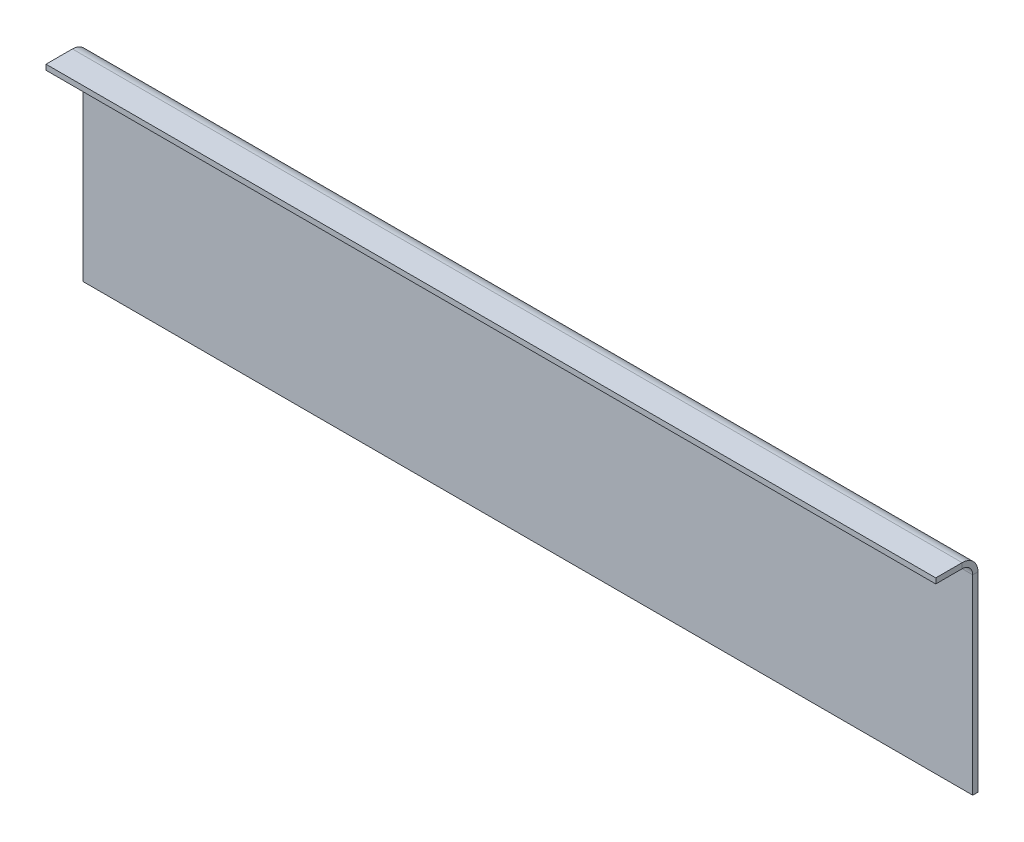
ISO-10303-21;
HEADER;
FILE_DESCRIPTION(('STEP AP214'),'2;1');
FILE_NAME('part.step','',(''),(''),'','','');
FILE_SCHEMA(('AUTOMOTIVE_DESIGN { 1 0 10303 214 1 1 1 1 }'));
ENDSEC;
DATA;
#1=APPLICATION_CONTEXT('core data for automotive mechanical design processes');
#2=APPLICATION_PROTOCOL_DEFINITION('international standard','automotive_design',2000,#1);
#3=PRODUCT_CONTEXT('',#1,'mechanical');
#4=PRODUCT('Part','Part','',(#3));
#5=PRODUCT_RELATED_PRODUCT_CATEGORY('part','',(#4));
#6=PRODUCT_DEFINITION_FORMATION('','',#4);
#7=PRODUCT_DEFINITION_CONTEXT('part definition',#1,'design');
#8=PRODUCT_DEFINITION('design','',#6,#7);
#9=PRODUCT_DEFINITION_SHAPE('','',#8);
#10=(LENGTH_UNIT() NAMED_UNIT(*) SI_UNIT(.MILLI.,.METRE.));
#11=(NAMED_UNIT(*) PLANE_ANGLE_UNIT() SI_UNIT($,.RADIAN.));
#12=(NAMED_UNIT(*) SI_UNIT($,.STERADIAN.) SOLID_ANGLE_UNIT());
#13=UNCERTAINTY_MEASURE_WITH_UNIT(LENGTH_MEASURE(1.E-05),#10,'distance_accuracy_value','');
#14=(GEOMETRIC_REPRESENTATION_CONTEXT(3) GLOBAL_UNCERTAINTY_ASSIGNED_CONTEXT((#13)) GLOBAL_UNIT_ASSIGNED_CONTEXT((#10,
#11,#12)) REPRESENTATION_CONTEXT('',''));
#15=CARTESIAN_POINT('',(0.,0.,0.));
#16=DIRECTION('',(0.,0.,1.));
#17=DIRECTION('',(1.,0.,0.));
#18=AXIS2_PLACEMENT_3D('',#15,#16,#17);
#19=CARTESIAN_POINT('',(0.,0.,-3.175));
#20=DIRECTION('',(-1.,0.,0.));
#21=DIRECTION('',(0.,0.,1.));
#22=AXIS2_PLACEMENT_3D('',#19,#20,#21);
#23=PLANE('',#22);
#24=DIRECTION('',(0.,-1.,0.));
#25=VECTOR('',#24,1.);
#26=CARTESIAN_POINT('',(0.,0.,0.));
#27=LINE('',#26,#25);
#28=CARTESIAN_POINT('',(2.22044604925031E-13,114.7572,0.));
#29=VERTEX_POINT('',#28);
#30=CARTESIAN_POINT('',(0.,0.,0.));
#31=VERTEX_POINT('',#30);
#32=EDGE_CURVE('E90',#29,#31,#27,.T.);
#33=ORIENTED_EDGE('',*,*,#32,.F.);
#34=DIRECTION('',(0.,0.,-1.));
#35=VECTOR('',#34,1.);
#36=CARTESIAN_POINT('',(2.22044604925031E-13,114.7572,0.));
#37=LINE('',#36,#35);
#38=CARTESIAN_POINT('',(2.22044604925031E-13,114.7572,-3.175));
#39=VERTEX_POINT('',#38);
#40=EDGE_CURVE('E99',#29,#39,#37,.T.);
#41=ORIENTED_EDGE('',*,*,#40,.T.);
#42=DIRECTION('',(0.,-1.,0.));
#43=VECTOR('',#42,1.);
#44=CARTESIAN_POINT('',(0.,0.,-3.175));
#45=LINE('',#44,#43);
#46=CARTESIAN_POINT('',(0.,0.,-3.175));
#47=VERTEX_POINT('',#46);
#48=EDGE_CURVE('E86',#39,#47,#45,.T.);
#49=ORIENTED_EDGE('',*,*,#48,.T.);
#50=DIRECTION('',(0.,0.,1.));
#51=VECTOR('',#50,1.);
#52=CARTESIAN_POINT('',(0.,0.,-3.175));
#53=LINE('',#52,#51);
#54=EDGE_CURVE('E41',#47,#31,#53,.T.);
#55=ORIENTED_EDGE('',*,*,#54,.T.);
#56=EDGE_LOOP('',(#33,#41,#49,#55));
#57=FACE_BOUND('',#56,.T.);
#58=ADVANCED_FACE('F38',(#57),#23,.T.);
#59=CARTESIAN_POINT('',(0.,0.,-3.175));
#60=DIRECTION('',(0.,0.,-1.));
#61=DIRECTION('',(-1.,0.,0.));
#62=AXIS2_PLACEMENT_3D('',#59,#60,#61);
#63=PLANE('',#62);
#64=ORIENTED_EDGE('',*,*,#48,.F.);
#65=DIRECTION('',(-1.,0.,0.));
#66=VECTOR('',#65,1.);
#67=CARTESIAN_POINT('',(0.,114.7572,-3.175));
#68=LINE('',#67,#66);
#69=CARTESIAN_POINT('',(534.99766,114.7572,-3.175));
#70=VERTEX_POINT('',#69);
#71=EDGE_CURVE('E116',#39,#70,#68,.F.);
#72=ORIENTED_EDGE('',*,*,#71,.T.);
#73=DIRECTION('',(0.,1.,0.));
#74=VECTOR('',#73,1.);
#75=CARTESIAN_POINT('',(534.99766,0.,-3.175));
#76=LINE('',#75,#74);
#77=CARTESIAN_POINT('',(534.99766,0.,-3.175));
#78=VERTEX_POINT('',#77);
#79=EDGE_CURVE('E95',#78,#70,#76,.T.);
#80=ORIENTED_EDGE('',*,*,#79,.F.);
#81=DIRECTION('',(1.,0.,0.));
#82=VECTOR('',#81,1.);
#83=CARTESIAN_POINT('',(0.,0.,-3.175));
#84=LINE('',#83,#82);
#85=EDGE_CURVE('E77',#47,#78,#84,.T.);
#86=ORIENTED_EDGE('',*,*,#85,.F.);
#87=EDGE_LOOP('',(#64,#72,#80,#86));
#88=FACE_BOUND('',#87,.T.);
#89=ADVANCED_FACE('F213',(#88),#63,.T.);
#90=CARTESIAN_POINT('',(0.,0.,0.));
#91=DIRECTION('',(0.,0.,-1.));
#92=DIRECTION('',(-1.,0.,0.));
#93=AXIS2_PLACEMENT_3D('',#90,#91,#92);
#94=PLANE('',#93);
#95=DIRECTION('',(-1.,0.,0.));
#96=VECTOR('',#95,1.);
#97=CARTESIAN_POINT('',(0.,114.7572,0.));
#98=LINE('',#97,#96);
#99=CARTESIAN_POINT('',(534.99766,114.7572,0.));
#100=VERTEX_POINT('',#99);
#101=EDGE_CURVE('E106',#29,#100,#98,.F.);
#102=ORIENTED_EDGE('',*,*,#101,.F.);
#103=ORIENTED_EDGE('',*,*,#32,.T.);
#104=DIRECTION('',(1.,0.,0.));
#105=VECTOR('',#104,1.);
#106=CARTESIAN_POINT('',(0.,0.,0.));
#107=LINE('',#106,#105);
#108=CARTESIAN_POINT('',(534.99766,0.,0.));
#109=VERTEX_POINT('',#108);
#110=EDGE_CURVE('E75',#31,#109,#107,.T.);
#111=ORIENTED_EDGE('',*,*,#110,.T.);
#112=DIRECTION('',(0.,1.,0.));
#113=VECTOR('',#112,1.);
#114=CARTESIAN_POINT('',(534.99766,0.,0.));
#115=LINE('',#114,#113);
#116=EDGE_CURVE('E80',#109,#100,#115,.T.);
#117=ORIENTED_EDGE('',*,*,#116,.T.);
#118=EDGE_LOOP('',(#102,#103,#111,#117));
#119=FACE_BOUND('',#118,.T.);
#120=ADVANCED_FACE('F88',(#119),#94,.F.);
#121=CARTESIAN_POINT('',(534.99766,0.,-3.175));
#122=DIRECTION('',(1.,0.,0.));
#123=DIRECTION('',(0.,0.,-1.));
#124=AXIS2_PLACEMENT_3D('',#121,#122,#123);
#125=PLANE('',#124);
#126=DIRECTION('',(0.,0.,-1.));
#127=VECTOR('',#126,1.);
#128=CARTESIAN_POINT('',(534.99766,114.7572,0.));
#129=LINE('',#128,#127);
#130=EDGE_CURVE('E83',#100,#70,#129,.T.);
#131=ORIENTED_EDGE('',*,*,#130,.F.);
#132=ORIENTED_EDGE('',*,*,#116,.F.);
#133=DIRECTION('',(0.,0.,1.));
#134=VECTOR('',#133,1.);
#135=CARTESIAN_POINT('',(534.99766,0.,-3.175));
#136=LINE('',#135,#134);
#137=EDGE_CURVE('E11',#78,#109,#136,.T.);
#138=ORIENTED_EDGE('',*,*,#137,.F.);
#139=ORIENTED_EDGE('',*,*,#79,.T.);
#140=EDGE_LOOP('',(#131,#132,#138,#139));
#141=FACE_BOUND('',#140,.T.);
#142=ADVANCED_FACE('F81',(#141),#125,.T.);
#143=CARTESIAN_POINT('',(0.,0.,-3.175));
#144=DIRECTION('',(0.,-1.,0.));
#145=DIRECTION('',(0.,0.,-1.));
#146=AXIS2_PLACEMENT_3D('',#143,#144,#145);
#147=PLANE('',#146);
#148=ORIENTED_EDGE('',*,*,#110,.F.);
#149=ORIENTED_EDGE('',*,*,#54,.F.);
#150=ORIENTED_EDGE('',*,*,#85,.T.);
#151=ORIENTED_EDGE('',*,*,#137,.T.);
#152=EDGE_LOOP('',(#148,#149,#150,#151));
#153=FACE_BOUND('',#152,.T.);
#154=ADVANCED_FACE('F72',(#153),#147,.T.);
#155=CARTESIAN_POINT('',(534.99766,114.7572,6.35));
#156=DIRECTION('',(1.,0.,0.));
#157=DIRECTION('',(0.,0.,-1.));
#158=AXIS2_PLACEMENT_3D('',#155,#156,#157);
#159=PLANE('',#158);
#160=DIRECTION('',(0.,1.,0.));
#161=VECTOR('',#160,1.);
#162=CARTESIAN_POINT('',(534.99766,121.1072,6.34999999999998));
#163=LINE('',#162,#161);
#164=CARTESIAN_POINT('',(534.99766,121.1072,6.34999999999997));
#165=VERTEX_POINT('',#164);
#166=CARTESIAN_POINT('',(534.99766,124.2822,6.34999999999996));
#167=VERTEX_POINT('',#166);
#168=EDGE_CURVE('E147',#165,#167,#163,.T.);
#169=ORIENTED_EDGE('',*,*,#168,.F.);
#170=CARTESIAN_POINT('',(534.99766,114.7572,6.35));
#171=DIRECTION('',(-1.,0.,0.));
#172=DIRECTION('',(0.,0.,1.));
#173=AXIS2_PLACEMENT_3D('',#170,#171,#172);
#174=CIRCLE('',#173,6.34999999999999);
#175=EDGE_CURVE('E110',#100,#165,#174,.F.);
#176=ORIENTED_EDGE('',*,*,#175,.F.);
#177=ORIENTED_EDGE('',*,*,#130,.T.);
#178=CARTESIAN_POINT('',(534.99766,114.7572,6.35));
#179=DIRECTION('',(-1.,0.,0.));
#180=DIRECTION('',(0.,0.,1.));
#181=AXIS2_PLACEMENT_3D('',#178,#179,#180);
#182=CIRCLE('',#181,9.525);
#183=EDGE_CURVE('E52',#70,#167,#182,.F.);
#184=ORIENTED_EDGE('',*,*,#183,.T.);
#185=EDGE_LOOP('',(#169,#176,#177,#184));
#186=FACE_BOUND('',#185,.T.);
#187=ADVANCED_FACE('F198',(#186),#159,.T.);
#188=CARTESIAN_POINT('',(2.22044604925031E-13,114.7572,6.35));
#189=DIRECTION('',(1.,0.,0.));
#190=DIRECTION('',(0.,0.,-1.));
#191=AXIS2_PLACEMENT_3D('',#188,#189,#190);
#192=PLANE('',#191);
#193=CARTESIAN_POINT('',(2.22044604925031E-13,114.7572,6.35));
#194=DIRECTION('',(-1.,0.,0.));
#195=DIRECTION('',(0.,0.,1.));
#196=AXIS2_PLACEMENT_3D('',#193,#194,#195);
#197=CIRCLE('',#196,6.34999999999999);
#198=CARTESIAN_POINT('',(2.22044604925031E-13,121.1072,6.34999999999997));
#199=VERTEX_POINT('',#198);
#200=EDGE_CURVE('E103',#199,#29,#197,.T.);
#201=ORIENTED_EDGE('',*,*,#200,.F.);
#202=DIRECTION('',(0.,1.,0.));
#203=VECTOR('',#202,1.);
#204=CARTESIAN_POINT('',(2.22044604925031E-13,121.1072,6.34999999999997));
#205=LINE('',#204,#203);
#206=CARTESIAN_POINT('',(0.,124.2822,6.34999999999996));
#207=VERTEX_POINT('',#206);
#208=EDGE_CURVE('E146',#199,#207,#205,.T.);
#209=ORIENTED_EDGE('',*,*,#208,.T.);
#210=CARTESIAN_POINT('',(2.22044604925031E-13,114.7572,6.35));
#211=DIRECTION('',(-1.,0.,0.));
#212=DIRECTION('',(0.,0.,1.));
#213=AXIS2_PLACEMENT_3D('',#210,#211,#212);
#214=CIRCLE('',#213,9.525);
#215=EDGE_CURVE('E113',#207,#39,#214,.T.);
#216=ORIENTED_EDGE('',*,*,#215,.T.);
#217=ORIENTED_EDGE('',*,*,#40,.F.);
#218=EDGE_LOOP('',(#201,#209,#216,#217));
#219=FACE_BOUND('',#218,.T.);
#220=ADVANCED_FACE('F166',(#219),#192,.F.);
#221=CARTESIAN_POINT('',(0.,114.7572,6.35));
#222=DIRECTION('',(-1.,0.,0.));
#223=DIRECTION('',(0.,1.,0.));
#224=AXIS2_PLACEMENT_3D('',#221,#222,#223);
#225=CYLINDRICAL_SURFACE('',#224,9.525);
#226=ORIENTED_EDGE('',*,*,#71,.F.);
#227=ORIENTED_EDGE('',*,*,#215,.F.);
#228=DIRECTION('',(-1.,0.,0.));
#229=VECTOR('',#228,1.);
#230=CARTESIAN_POINT('',(0.,124.2822,6.34999999999995));
#231=LINE('',#230,#229);
#232=EDGE_CURVE('E136',#167,#207,#231,.T.);
#233=ORIENTED_EDGE('',*,*,#232,.F.);
#234=ORIENTED_EDGE('',*,*,#183,.F.);
#235=EDGE_LOOP('',(#226,#227,#233,#234));
#236=FACE_BOUND('',#235,.T.);
#237=ADVANCED_FACE('F221',(#236),#225,.T.);
#238=CARTESIAN_POINT('',(0.,114.7572,6.35));
#239=DIRECTION('',(-1.,0.,0.));
#240=DIRECTION('',(0.,1.,0.));
#241=AXIS2_PLACEMENT_3D('',#238,#239,#240);
#242=CYLINDRICAL_SURFACE('',#241,6.34999999999999);
#243=ORIENTED_EDGE('',*,*,#101,.T.);
#244=ORIENTED_EDGE('',*,*,#175,.T.);
#245=DIRECTION('',(-1.,0.,0.));
#246=VECTOR('',#245,1.);
#247=CARTESIAN_POINT('',(534.99766,121.1072,6.34999999999998));
#248=LINE('',#247,#246);
#249=EDGE_CURVE('E150',#165,#199,#248,.T.);
#250=ORIENTED_EDGE('',*,*,#249,.T.);
#251=ORIENTED_EDGE('',*,*,#200,.T.);
#252=EDGE_LOOP('',(#243,#244,#250,#251));
#253=FACE_BOUND('',#252,.T.);
#254=ADVANCED_FACE('F158',(#253),#242,.F.);
#255=CARTESIAN_POINT('',(0.,124.2822,0.));
#256=DIRECTION('',(-1.,0.,0.));
#257=DIRECTION('',(0.,0.,1.));
#258=AXIS2_PLACEMENT_3D('',#255,#256,#257);
#259=PLANE('',#258);
#260=DIRECTION('',(0.,0.,-1.));
#261=VECTOR('',#260,1.);
#262=CARTESIAN_POINT('',(0.,124.2822,0.));
#263=LINE('',#262,#261);
#264=CARTESIAN_POINT('',(0.,124.2822,22.225));
#265=VERTEX_POINT('',#264);
#266=EDGE_CURVE('E123',#265,#207,#263,.T.);
#267=ORIENTED_EDGE('',*,*,#266,.T.);
#268=ORIENTED_EDGE('',*,*,#208,.F.);
#269=DIRECTION('',(0.,0.,-1.));
#270=VECTOR('',#269,1.);
#271=CARTESIAN_POINT('',(0.,121.1072,0.));
#272=LINE('',#271,#270);
#273=CARTESIAN_POINT('',(0.,121.1072,22.225));
#274=VERTEX_POINT('',#273);
#275=EDGE_CURVE('E126',#274,#199,#272,.T.);
#276=ORIENTED_EDGE('',*,*,#275,.F.);
#277=DIRECTION('',(0.,-1.,0.));
#278=VECTOR('',#277,1.);
#279=CARTESIAN_POINT('',(0.,124.2822,22.225));
#280=LINE('',#279,#278);
#281=EDGE_CURVE('E107',#265,#274,#280,.T.);
#282=ORIENTED_EDGE('',*,*,#281,.F.);
#283=EDGE_LOOP('',(#267,#268,#276,#282));
#284=FACE_BOUND('',#283,.T.);
#285=ADVANCED_FACE('F175',(#284),#259,.T.);
#286=CARTESIAN_POINT('',(534.99766,124.2822,22.225));
#287=DIRECTION('',(1.,0.,0.));
#288=DIRECTION('',(0.,0.,-1.));
#289=AXIS2_PLACEMENT_3D('',#286,#287,#288);
#290=PLANE('',#289);
#291=DIRECTION('',(0.,0.,1.));
#292=VECTOR('',#291,1.);
#293=CARTESIAN_POINT('',(534.99766,121.1072,22.225));
#294=LINE('',#293,#292);
#295=CARTESIAN_POINT('',(534.99766,121.1072,22.225));
#296=VERTEX_POINT('',#295);
#297=EDGE_CURVE('E133',#165,#296,#294,.T.);
#298=ORIENTED_EDGE('',*,*,#297,.F.);
#299=ORIENTED_EDGE('',*,*,#168,.T.);
#300=DIRECTION('',(0.,0.,1.));
#301=VECTOR('',#300,1.);
#302=CARTESIAN_POINT('',(534.99766,124.2822,22.225));
#303=LINE('',#302,#301);
#304=CARTESIAN_POINT('',(534.99766,124.2822,22.225));
#305=VERTEX_POINT('',#304);
#306=EDGE_CURVE('E129',#167,#305,#303,.T.);
#307=ORIENTED_EDGE('',*,*,#306,.T.);
#308=DIRECTION('',(0.,-1.,0.));
#309=VECTOR('',#308,1.);
#310=CARTESIAN_POINT('',(534.99766,124.2822,22.225));
#311=LINE('',#310,#309);
#312=EDGE_CURVE('E120',#305,#296,#311,.T.);
#313=ORIENTED_EDGE('',*,*,#312,.T.);
#314=EDGE_LOOP('',(#298,#299,#307,#313));
#315=FACE_BOUND('',#314,.T.);
#316=ADVANCED_FACE('F200',(#315),#290,.T.);
#317=CARTESIAN_POINT('',(0.,124.2822,-4.64817743086205E-13));
#318=DIRECTION('',(0.,1.,0.));
#319=DIRECTION('',(0.,0.,1.));
#320=AXIS2_PLACEMENT_3D('',#317,#318,#319);
#321=PLANE('',#320);
#322=ORIENTED_EDGE('',*,*,#306,.F.);
#323=ORIENTED_EDGE('',*,*,#232,.T.);
#324=ORIENTED_EDGE('',*,*,#266,.F.);
#325=DIRECTION('',(-1.,0.,0.));
#326=VECTOR('',#325,1.);
#327=CARTESIAN_POINT('',(0.,124.2822,22.225));
#328=LINE('',#327,#326);
#329=EDGE_CURVE('E139',#305,#265,#328,.T.);
#330=ORIENTED_EDGE('',*,*,#329,.F.);
#331=EDGE_LOOP('',(#322,#323,#324,#330));
#332=FACE_BOUND('',#331,.T.);
#333=ADVANCED_FACE('F183',(#332),#321,.T.);
#334=CARTESIAN_POINT('',(0.,121.1072,-4.53732289835378E-13));
#335=DIRECTION('',(0.,1.,0.));
#336=DIRECTION('',(0.,0.,1.));
#337=AXIS2_PLACEMENT_3D('',#334,#335,#336);
#338=PLANE('',#337);
#339=ORIENTED_EDGE('',*,*,#249,.F.);
#340=ORIENTED_EDGE('',*,*,#297,.T.);
#341=DIRECTION('',(-1.,0.,0.));
#342=VECTOR('',#341,1.);
#343=CARTESIAN_POINT('',(0.,121.1072,22.225));
#344=LINE('',#343,#342);
#345=EDGE_CURVE('E130',#296,#274,#344,.T.);
#346=ORIENTED_EDGE('',*,*,#345,.T.);
#347=ORIENTED_EDGE('',*,*,#275,.T.);
#348=EDGE_LOOP('',(#339,#340,#346,#347));
#349=FACE_BOUND('',#348,.T.);
#350=ADVANCED_FACE('F170',(#349),#338,.F.);
#351=CARTESIAN_POINT('',(0.,124.2822,22.225));
#352=DIRECTION('',(0.,0.,1.));
#353=DIRECTION('',(0.,-1.,0.));
#354=AXIS2_PLACEMENT_3D('',#351,#352,#353);
#355=PLANE('',#354);
#356=ORIENTED_EDGE('',*,*,#345,.F.);
#357=ORIENTED_EDGE('',*,*,#312,.F.);
#358=ORIENTED_EDGE('',*,*,#329,.T.);
#359=ORIENTED_EDGE('',*,*,#281,.T.);
#360=EDGE_LOOP('',(#356,#357,#358,#359));
#361=FACE_BOUND('',#360,.T.);
#362=ADVANCED_FACE('F203',(#361),#355,.T.);
#363=CLOSED_SHELL('',(#58,#89,#120,#142,#154,#187,#220,#237,#254,#285,#316,#333,#350,#362));
#364=MANIFOLD_SOLID_BREP('B2',#363);
#365=ADVANCED_BREP_SHAPE_REPRESENTATION('',(#18,#364),#14);
#366=SHAPE_DEFINITION_REPRESENTATION(#9,#365);
ENDSEC;
END-ISO-10303-21;
